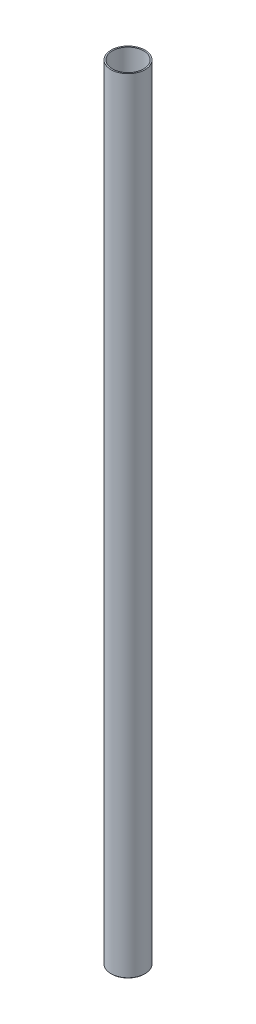
ISO-10303-21;
HEADER;
FILE_DESCRIPTION(('STEP AP214'),'2;1');
FILE_NAME('part.step','',(''),(''),'','','');
FILE_SCHEMA(('AUTOMOTIVE_DESIGN { 1 0 10303 214 1 1 1 1 }'));
ENDSEC;
DATA;
#1=APPLICATION_CONTEXT('core data for automotive mechanical design processes');
#2=APPLICATION_PROTOCOL_DEFINITION('international standard','automotive_design',2000,#1);
#3=PRODUCT_CONTEXT('',#1,'mechanical');
#4=PRODUCT('Part','Part','',(#3));
#5=PRODUCT_RELATED_PRODUCT_CATEGORY('part','',(#4));
#6=PRODUCT_DEFINITION_FORMATION('','',#4);
#7=PRODUCT_DEFINITION_CONTEXT('part definition',#1,'design');
#8=PRODUCT_DEFINITION('design','',#6,#7);
#9=PRODUCT_DEFINITION_SHAPE('','',#8);
#10=(LENGTH_UNIT() NAMED_UNIT(*) SI_UNIT(.MILLI.,.METRE.));
#11=(NAMED_UNIT(*) PLANE_ANGLE_UNIT() SI_UNIT($,.RADIAN.));
#12=(NAMED_UNIT(*) SI_UNIT($,.STERADIAN.) SOLID_ANGLE_UNIT());
#13=UNCERTAINTY_MEASURE_WITH_UNIT(LENGTH_MEASURE(1.E-05),#10,'distance_accuracy_value','');
#14=(GEOMETRIC_REPRESENTATION_CONTEXT(3) GLOBAL_UNCERTAINTY_ASSIGNED_CONTEXT((#13)) GLOBAL_UNIT_ASSIGNED_CONTEXT((#10,
#11,#12)) REPRESENTATION_CONTEXT('',''));
#15=CARTESIAN_POINT('',(0.,0.,0.));
#16=DIRECTION('',(0.,0.,1.));
#17=DIRECTION('',(1.,0.,0.));
#18=AXIS2_PLACEMENT_3D('',#15,#16,#17);
#19=CARTESIAN_POINT('',(6.5,0.,0.));
#20=DIRECTION('',(0.,-1.,0.));
#21=DIRECTION('',(0.,0.,-1.));
#22=AXIS2_PLACEMENT_3D('',#19,#20,#21);
#23=PLANE('',#22);
#24=CARTESIAN_POINT('',(6.5,0.,0.));
#25=DIRECTION('',(0.,1.,0.));
#26=DIRECTION('',(-1.,0.,0.));
#27=AXIS2_PLACEMENT_3D('',#24,#25,#26);
#28=CIRCLE('',#27,6.);
#29=CARTESIAN_POINT('',(12.5,0.,0.));
#30=VERTEX_POINT('',#29);
#31=EDGE_CURVE('E28',#30,#30,#28,.T.);
#32=ORIENTED_EDGE('',*,*,#31,.F.);
#33=EDGE_LOOP('',(#32));
#34=FACE_BOUND('',#33,.T.);
#35=CARTESIAN_POINT('',(6.5,0.,0.));
#36=DIRECTION('',(0.,-1.,0.));
#37=DIRECTION('',(-1.,0.,0.));
#38=AXIS2_PLACEMENT_3D('',#35,#36,#37);
#39=CIRCLE('',#38,6.5);
#40=CARTESIAN_POINT('',(13.,0.,0.));
#41=VERTEX_POINT('',#40);
#42=EDGE_CURVE('E78',#41,#41,#39,.T.);
#43=ORIENTED_EDGE('',*,*,#42,.F.);
#44=EDGE_LOOP('',(#43));
#45=FACE_BOUND('',#44,.T.);
#46=ADVANCED_FACE('F17',(#34,#45),#23,.F.);
#47=CARTESIAN_POINT('',(6.5,15.,0.));
#48=DIRECTION('',(0.,-1.,0.));
#49=DIRECTION('',(-1.,0.,0.));
#50=AXIS2_PLACEMENT_3D('',#47,#48,#49);
#51=CYLINDRICAL_SURFACE('',#50,6.);
#52=ORIENTED_EDGE('',*,*,#31,.T.);
#53=DIRECTION('',(0.,-1.,0.));
#54=VECTOR('',#53,1.);
#55=CARTESIAN_POINT('',(12.5,15.,0.));
#56=LINE('',#55,#54);
#57=CARTESIAN_POINT('',(12.5,-300.,0.));
#58=VERTEX_POINT('',#57);
#59=EDGE_CURVE('E11',#30,#58,#56,.T.);
#60=ORIENTED_EDGE('',*,*,#59,.T.);
#61=CARTESIAN_POINT('',(6.5,-300.,0.));
#62=DIRECTION('',(0.,1.,0.));
#63=DIRECTION('',(-1.,0.,0.));
#64=AXIS2_PLACEMENT_3D('',#61,#62,#63);
#65=CIRCLE('',#64,6.);
#66=EDGE_CURVE('E61',#58,#58,#65,.T.);
#67=ORIENTED_EDGE('',*,*,#66,.F.);
#68=ORIENTED_EDGE('',*,*,#59,.F.);
#69=EDGE_LOOP('',(#52,#60,#67,#68));
#70=FACE_BOUND('',#69,.T.);
#71=ADVANCED_FACE('F87',(#70),#51,.F.);
#72=CARTESIAN_POINT('',(6.5,-300.,0.));
#73=DIRECTION('',(0.,-1.,0.));
#74=DIRECTION('',(0.,0.,-1.));
#75=AXIS2_PLACEMENT_3D('',#72,#73,#74);
#76=PLANE('',#75);
#77=ORIENTED_EDGE('',*,*,#66,.T.);
#78=EDGE_LOOP('',(#77));
#79=FACE_BOUND('',#78,.T.);
#80=CARTESIAN_POINT('',(6.5,-300.,0.));
#81=DIRECTION('',(0.,-1.,0.));
#82=DIRECTION('',(0.,0.,-1.));
#83=AXIS2_PLACEMENT_3D('',#80,#81,#82);
#84=CIRCLE('',#83,6.29975070044989);
#85=CARTESIAN_POINT('',(6.5,-300.,6.29975070044989));
#86=VERTEX_POINT('',#85);
#87=EDGE_CURVE('E57',#86,#86,#84,.T.);
#88=ORIENTED_EDGE('',*,*,#87,.T.);
#89=EDGE_LOOP('',(#88));
#90=FACE_BOUND('',#89,.T.);
#91=ADVANCED_FACE('F19',(#79,#90),#76,.T.);
#92=CARTESIAN_POINT('',(6.5,-299.8998702408,0.));
#93=DIRECTION('',(0.,1.,0.));
#94=DIRECTION('',(0.,0.,-1.));
#95=AXIS2_PLACEMENT_3D('',#92,#93,#94);
#96=CONICAL_SURFACE('',#95,6.39987649738,0.785378377330313);
#97=CARTESIAN_POINT('',(6.5,-299.799742776001,0.));
#98=DIRECTION('',(0.,-1.,0.));
#99=DIRECTION('',(-1.,0.,0.));
#100=AXIS2_PLACEMENT_3D('',#97,#98,#99);
#101=CIRCLE('',#100,6.5);
#102=CARTESIAN_POINT('',(13.,-299.799742776001,0.));
#103=VERTEX_POINT('',#102);
#104=CARTESIAN_POINT('',(6.5,-299.799742776001,6.5));
#105=VERTEX_POINT('',#104);
#106=EDGE_CURVE('E74',#103,#105,#101,.T.);
#107=ORIENTED_EDGE('',*,*,#106,.T.);
#108=DIRECTION('',(0.,-0.707120771910379,-0.707092790185892));
#109=VECTOR('',#108,1.);
#110=CARTESIAN_POINT('',(6.5,-299.8998702408,6.39987649738));
#111=LINE('',#110,#109);
#112=EDGE_CURVE('E62',#105,#86,#111,.T.);
#113=ORIENTED_EDGE('',*,*,#112,.T.);
#114=ORIENTED_EDGE('',*,*,#87,.F.);
#115=ORIENTED_EDGE('',*,*,#112,.F.);
#116=CARTESIAN_POINT('',(6.5,-299.799742776001,0.));
#117=DIRECTION('',(0.,-1.,0.));
#118=DIRECTION('',(-1.,0.,0.));
#119=AXIS2_PLACEMENT_3D('',#116,#117,#118);
#120=CIRCLE('',#119,6.5);
#121=EDGE_CURVE('E71',#105,#103,#120,.T.);
#122=ORIENTED_EDGE('',*,*,#121,.T.);
#123=EDGE_LOOP('',(#107,#113,#114,#115,#122));
#124=FACE_BOUND('',#123,.T.);
#125=ADVANCED_FACE('F132',(#124),#96,.T.);
#126=CARTESIAN_POINT('',(6.5,15.,0.));
#127=DIRECTION('',(0.,-1.,0.));
#128=DIRECTION('',(-1.,0.,0.));
#129=AXIS2_PLACEMENT_3D('',#126,#127,#128);
#130=CYLINDRICAL_SURFACE('',#129,6.5);
#131=ORIENTED_EDGE('',*,*,#106,.F.);
#132=DIRECTION('',(0.,1.,0.));
#133=VECTOR('',#132,1.);
#134=CARTESIAN_POINT('',(13.,15.,0.));
#135=LINE('',#134,#133);
#136=EDGE_CURVE('E21',#103,#41,#135,.T.);
#137=ORIENTED_EDGE('',*,*,#136,.T.);
#138=ORIENTED_EDGE('',*,*,#42,.T.);
#139=ORIENTED_EDGE('',*,*,#136,.F.);
#140=ORIENTED_EDGE('',*,*,#121,.F.);
#141=EDGE_LOOP('',(#131,#137,#138,#139,#140));
#142=FACE_BOUND('',#141,.T.);
#143=ADVANCED_FACE('F97',(#142),#130,.T.);
#144=CLOSED_SHELL('',(#46,#71,#91,#125,#143));
#145=MANIFOLD_SOLID_BREP('B1',#144);
#146=ADVANCED_BREP_SHAPE_REPRESENTATION('',(#18,#145),#14);
#147=SHAPE_DEFINITION_REPRESENTATION(#9,#146);
ENDSEC;
END-ISO-10303-21;
